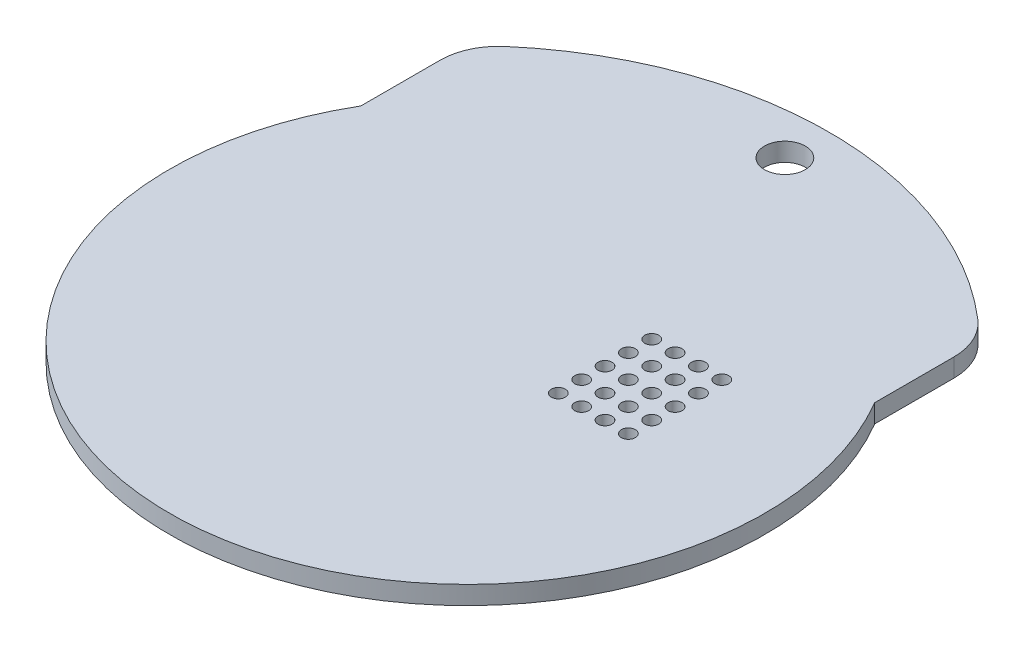
ISO-10303-21;
HEADER;
FILE_DESCRIPTION(('STEP AP214'),'2;1');
FILE_NAME('part.step','',(''),(''),'','','');
FILE_SCHEMA(('AUTOMOTIVE_DESIGN { 1 0 10303 214 1 1 1 1 }'));
ENDSEC;
DATA;
#1=APPLICATION_CONTEXT('core data for automotive mechanical design processes');
#2=APPLICATION_PROTOCOL_DEFINITION('international standard','automotive_design',2000,#1);
#3=PRODUCT_CONTEXT('',#1,'mechanical');
#4=PRODUCT('Part','Part','',(#3));
#5=PRODUCT_RELATED_PRODUCT_CATEGORY('part','',(#4));
#6=PRODUCT_DEFINITION_FORMATION('','',#4);
#7=PRODUCT_DEFINITION_CONTEXT('part definition',#1,'design');
#8=PRODUCT_DEFINITION('design','',#6,#7);
#9=PRODUCT_DEFINITION_SHAPE('','',#8);
#10=(LENGTH_UNIT() NAMED_UNIT(*) SI_UNIT(.MILLI.,.METRE.));
#11=(NAMED_UNIT(*) PLANE_ANGLE_UNIT() SI_UNIT($,.RADIAN.));
#12=(NAMED_UNIT(*) SI_UNIT($,.STERADIAN.) SOLID_ANGLE_UNIT());
#13=UNCERTAINTY_MEASURE_WITH_UNIT(LENGTH_MEASURE(1.E-05),#10,'distance_accuracy_value','');
#14=(GEOMETRIC_REPRESENTATION_CONTEXT(3) GLOBAL_UNCERTAINTY_ASSIGNED_CONTEXT((#13)) GLOBAL_UNIT_ASSIGNED_CONTEXT((#10,
#11,#12)) REPRESENTATION_CONTEXT('',''));
#15=CARTESIAN_POINT('',(0.,0.,0.));
#16=DIRECTION('',(0.,0.,1.));
#17=DIRECTION('',(1.,0.,0.));
#18=AXIS2_PLACEMENT_3D('',#15,#16,#17);
#19=CARTESIAN_POINT('',(0.,2.,0.));
#20=DIRECTION('',(0.,-1.,0.));
#21=DIRECTION('',(0.,0.,-1.));
#22=AXIS2_PLACEMENT_3D('',#19,#20,#21);
#23=CYLINDRICAL_SURFACE('',#22,32.385);
#24=CARTESIAN_POINT('',(0.,0.,0.));
#25=DIRECTION('',(0.,1.,0.));
#26=DIRECTION('',(0.,0.,1.));
#27=AXIS2_PLACEMENT_3D('',#24,#25,#26);
#28=CIRCLE('',#27,32.385);
#29=CARTESIAN_POINT('',(-27.94,0.,-16.3751221369491));
#30=VERTEX_POINT('',#29);
#31=CARTESIAN_POINT('',(27.94,0.,-16.3751221369491));
#32=VERTEX_POINT('',#31);
#33=EDGE_CURVE('E103',#30,#32,#28,.T.);
#34=ORIENTED_EDGE('',*,*,#33,.T.);
#35=DIRECTION('',(0.,-1.,0.));
#36=VECTOR('',#35,1.);
#37=CARTESIAN_POINT('',(27.94,2.,-16.3751221369491));
#38=LINE('',#37,#36);
#39=CARTESIAN_POINT('',(27.94,2.,-16.3751221369491));
#40=VERTEX_POINT('',#39);
#41=EDGE_CURVE('E90',#40,#32,#38,.T.);
#42=ORIENTED_EDGE('',*,*,#41,.F.);
#43=CARTESIAN_POINT('',(0.,2.,0.));
#44=DIRECTION('',(0.,1.,0.));
#45=DIRECTION('',(0.,0.,1.));
#46=AXIS2_PLACEMENT_3D('',#43,#44,#45);
#47=CIRCLE('',#46,32.385);
#48=CARTESIAN_POINT('',(-27.94,2.,-16.3751221369491));
#49=VERTEX_POINT('',#48);
#50=EDGE_CURVE('E94',#49,#40,#47,.T.);
#51=ORIENTED_EDGE('',*,*,#50,.F.);
#52=DIRECTION('',(0.,-1.,0.));
#53=VECTOR('',#52,1.);
#54=CARTESIAN_POINT('',(-27.94,2.,-16.3751221369491));
#55=LINE('',#54,#53);
#56=EDGE_CURVE('E105',#49,#30,#55,.T.);
#57=ORIENTED_EDGE('',*,*,#56,.T.);
#58=EDGE_LOOP('',(#34,#42,#51,#57));
#59=FACE_BOUND('',#58,.T.);
#60=ADVANCED_FACE('F32',(#59),#23,.T.);
#61=CARTESIAN_POINT('',(27.94,2.,-3.4925));
#62=DIRECTION('',(-1.,0.,0.));
#63=DIRECTION('',(0.,0.,1.));
#64=AXIS2_PLACEMENT_3D('',#61,#62,#63);
#65=PLANE('',#64);
#66=DIRECTION('',(0.,0.,-1.));
#67=VECTOR('',#66,1.);
#68=CARTESIAN_POINT('',(27.94,0.,-3.4925));
#69=LINE('',#68,#67);
#70=CARTESIAN_POINT('',(27.94,0.,-24.9838407775906));
#71=VERTEX_POINT('',#70);
#72=EDGE_CURVE('E131',#32,#71,#69,.T.);
#73=ORIENTED_EDGE('',*,*,#72,.T.);
#74=DIRECTION('',(0.,1.,0.));
#75=VECTOR('',#74,1.);
#76=CARTESIAN_POINT('',(27.94,2.,-24.9838407775906));
#77=LINE('',#76,#75);
#78=CARTESIAN_POINT('',(27.94,2.,-24.9838407775906));
#79=VERTEX_POINT('',#78);
#80=EDGE_CURVE('E55',#71,#79,#77,.T.);
#81=ORIENTED_EDGE('',*,*,#80,.T.);
#82=DIRECTION('',(0.,0.,-1.));
#83=VECTOR('',#82,1.);
#84=CARTESIAN_POINT('',(27.94,2.,-3.4925));
#85=LINE('',#84,#83);
#86=EDGE_CURVE('E86',#40,#79,#85,.T.);
#87=ORIENTED_EDGE('',*,*,#86,.F.);
#88=ORIENTED_EDGE('',*,*,#41,.T.);
#89=EDGE_LOOP('',(#73,#81,#87,#88));
#90=FACE_BOUND('',#89,.T.);
#91=ADVANCED_FACE('F88',(#90),#65,.F.);
#92=CARTESIAN_POINT('',(0.,2.,0.));
#93=DIRECTION('',(0.,-1.,0.));
#94=DIRECTION('',(0.,0.,-1.));
#95=AXIS2_PLACEMENT_3D('',#92,#93,#94);
#96=CYLINDRICAL_SURFACE('',#95,39.37);
#97=CARTESIAN_POINT('',(0.,2.,0.));
#98=DIRECTION('',(0.,1.,0.));
#99=DIRECTION('',(0.,0.,1.));
#100=AXIS2_PLACEMENT_3D('',#97,#98,#99);
#101=CIRCLE('',#100,39.37);
#102=CARTESIAN_POINT('',(-25.7419230769231,2.,-29.7884255425119));
#103=VERTEX_POINT('',#102);
#104=CARTESIAN_POINT('',(25.7419230769231,2.,-29.7884255425119));
#105=VERTEX_POINT('',#104);
#106=EDGE_CURVE('E93',#103,#105,#101,.F.);
#107=ORIENTED_EDGE('',*,*,#106,.T.);
#108=DIRECTION('',(0.,-1.,0.));
#109=VECTOR('',#108,1.);
#110=CARTESIAN_POINT('',(25.7419230769231,2.,-29.7884255425119));
#111=LINE('',#110,#109);
#112=CARTESIAN_POINT('',(25.7419230769231,0.,-29.7884255425119));
#113=VERTEX_POINT('',#112);
#114=EDGE_CURVE('E107',#105,#113,#111,.T.);
#115=ORIENTED_EDGE('',*,*,#114,.T.);
#116=CARTESIAN_POINT('',(0.,0.,0.));
#117=DIRECTION('',(0.,1.,0.));
#118=DIRECTION('',(0.,0.,1.));
#119=AXIS2_PLACEMENT_3D('',#116,#117,#118);
#120=CIRCLE('',#119,39.37);
#121=CARTESIAN_POINT('',(-25.7419230769231,0.,-29.7884255425119));
#122=VERTEX_POINT('',#121);
#123=EDGE_CURVE('E132',#122,#113,#120,.F.);
#124=ORIENTED_EDGE('',*,*,#123,.F.);
#125=DIRECTION('',(0.,-1.,0.));
#126=VECTOR('',#125,1.);
#127=CARTESIAN_POINT('',(-25.7419230769231,2.,-29.7884255425119));
#128=LINE('',#127,#126);
#129=EDGE_CURVE('E104',#122,#103,#128,.F.);
#130=ORIENTED_EDGE('',*,*,#129,.T.);
#131=EDGE_LOOP('',(#107,#115,#124,#130));
#132=FACE_BOUND('',#131,.T.);
#133=ADVANCED_FACE('F123',(#132),#96,.T.);
#134=CARTESIAN_POINT('',(-27.94,2.,-3.4925));
#135=DIRECTION('',(-1.,0.,0.));
#136=DIRECTION('',(0.,0.,1.));
#137=AXIS2_PLACEMENT_3D('',#134,#135,#136);
#138=PLANE('',#137);
#139=DIRECTION('',(0.,0.,-1.));
#140=VECTOR('',#139,1.);
#141=CARTESIAN_POINT('',(-27.94,2.,-3.4925));
#142=LINE('',#141,#140);
#143=CARTESIAN_POINT('',(-27.94,2.,-24.9838407775906));
#144=VERTEX_POINT('',#143);
#145=EDGE_CURVE('E98',#49,#144,#142,.T.);
#146=ORIENTED_EDGE('',*,*,#145,.T.);
#147=DIRECTION('',(0.,-1.,0.));
#148=VECTOR('',#147,1.);
#149=CARTESIAN_POINT('',(-27.94,2.,-24.9838407775906));
#150=LINE('',#149,#148);
#151=CARTESIAN_POINT('',(-27.94,0.,-24.9838407775906));
#152=VERTEX_POINT('',#151);
#153=EDGE_CURVE('E11',#144,#152,#150,.T.);
#154=ORIENTED_EDGE('',*,*,#153,.T.);
#155=DIRECTION('',(0.,0.,-1.));
#156=VECTOR('',#155,1.);
#157=CARTESIAN_POINT('',(-27.94,0.,-3.4925));
#158=LINE('',#157,#156);
#159=EDGE_CURVE('E100',#30,#152,#158,.T.);
#160=ORIENTED_EDGE('',*,*,#159,.F.);
#161=ORIENTED_EDGE('',*,*,#56,.F.);
#162=EDGE_LOOP('',(#146,#154,#160,#161));
#163=FACE_BOUND('',#162,.T.);
#164=ADVANCED_FACE('F141',(#163),#138,.T.);
#165=CARTESIAN_POINT('',(-75.3283844524084,2.,-3.4925));
#166=DIRECTION('',(0.,1.,0.));
#167=DIRECTION('',(0.,0.,1.));
#168=AXIS2_PLACEMENT_3D('',#165,#166,#167);
#169=PLANE('',#168);
#170=CARTESIAN_POINT('',(17.4625000000001,2.,-0.0635000000000011));
#171=DIRECTION('',(0.,1.,0.));
#172=DIRECTION('',(0.,0.,1.));
#173=AXIS2_PLACEMENT_3D('',#170,#171,#172);
#174=CIRCLE('',#173,0.761999999999999);
#175=CARTESIAN_POINT('',(17.4625000000001,2.,0.698499999999998));
#176=VERTEX_POINT('',#175);
#177=EDGE_CURVE('E256',#176,#176,#174,.T.);
#178=ORIENTED_EDGE('',*,*,#177,.F.);
#179=EDGE_LOOP('',(#178));
#180=FACE_BOUND('',#179,.T.);
#181=CARTESIAN_POINT('',(14.9225000000001,2.,-0.0635000000000011));
#182=DIRECTION('',(0.,1.,0.));
#183=DIRECTION('',(0.,0.,1.));
#184=AXIS2_PLACEMENT_3D('',#181,#182,#183);
#185=CIRCLE('',#184,0.762000000000003);
#186=CARTESIAN_POINT('',(14.9225000000001,2.,0.698500000000002));
#187=VERTEX_POINT('',#186);
#188=EDGE_CURVE('E260',#187,#187,#185,.T.);
#189=ORIENTED_EDGE('',*,*,#188,.F.);
#190=EDGE_LOOP('',(#189));
#191=FACE_BOUND('',#190,.T.);
#192=CARTESIAN_POINT('',(12.3825000000001,2.,-0.0635000000000011));
#193=DIRECTION('',(0.,1.,0.));
#194=DIRECTION('',(0.,0.,1.));
#195=AXIS2_PLACEMENT_3D('',#192,#193,#194);
#196=CIRCLE('',#195,0.762000000000001);
#197=CARTESIAN_POINT('',(12.3825000000001,2.,0.6985));
#198=VERTEX_POINT('',#197);
#199=EDGE_CURVE('E267',#198,#198,#196,.T.);
#200=ORIENTED_EDGE('',*,*,#199,.F.);
#201=EDGE_LOOP('',(#200));
#202=FACE_BOUND('',#201,.T.);
#203=CARTESIAN_POINT('',(9.8425000000001,2.,-0.0635000000000011));
#204=DIRECTION('',(0.,1.,0.));
#205=DIRECTION('',(0.,0.,1.));
#206=AXIS2_PLACEMENT_3D('',#203,#204,#205);
#207=CIRCLE('',#206,0.762000000000001);
#208=CARTESIAN_POINT('',(9.8425000000001,2.,0.6985));
#209=VERTEX_POINT('',#208);
#210=EDGE_CURVE('E273',#209,#209,#207,.T.);
#211=ORIENTED_EDGE('',*,*,#210,.F.);
#212=EDGE_LOOP('',(#211));
#213=FACE_BOUND('',#212,.T.);
#214=CARTESIAN_POINT('',(9.84250000000008,2.,-2.6035));
#215=DIRECTION('',(0.,1.,0.));
#216=DIRECTION('',(0.,0.,1.));
#217=AXIS2_PLACEMENT_3D('',#214,#215,#216);
#218=CIRCLE('',#217,0.762000000000001);
#219=CARTESIAN_POINT('',(9.84250000000008,2.,-1.8415));
#220=VERTEX_POINT('',#219);
#221=EDGE_CURVE('E279',#220,#220,#218,.T.);
#222=ORIENTED_EDGE('',*,*,#221,.F.);
#223=EDGE_LOOP('',(#222));
#224=FACE_BOUND('',#223,.T.);
#225=CARTESIAN_POINT('',(12.3825000000001,2.,-2.6035));
#226=DIRECTION('',(0.,1.,0.));
#227=DIRECTION('',(0.,0.,1.));
#228=AXIS2_PLACEMENT_3D('',#225,#226,#227);
#229=CIRCLE('',#228,0.762000000000001);
#230=CARTESIAN_POINT('',(12.3825000000001,2.,-1.8415));
#231=VERTEX_POINT('',#230);
#232=EDGE_CURVE('E285',#231,#231,#229,.T.);
#233=ORIENTED_EDGE('',*,*,#232,.F.);
#234=EDGE_LOOP('',(#233));
#235=FACE_BOUND('',#234,.T.);
#236=CARTESIAN_POINT('',(14.9225000000001,2.,-2.6035));
#237=DIRECTION('',(0.,1.,0.));
#238=DIRECTION('',(0.,0.,1.));
#239=AXIS2_PLACEMENT_3D('',#236,#237,#238);
#240=CIRCLE('',#239,0.762000000000001);
#241=CARTESIAN_POINT('',(14.9225000000001,2.,-1.8415));
#242=VERTEX_POINT('',#241);
#243=EDGE_CURVE('E291',#242,#242,#240,.T.);
#244=ORIENTED_EDGE('',*,*,#243,.F.);
#245=EDGE_LOOP('',(#244));
#246=FACE_BOUND('',#245,.T.);
#247=CARTESIAN_POINT('',(17.4625000000001,2.,-2.6035));
#248=DIRECTION('',(0.,1.,0.));
#249=DIRECTION('',(0.,0.,1.));
#250=AXIS2_PLACEMENT_3D('',#247,#248,#249);
#251=CIRCLE('',#250,0.761999999999999);
#252=CARTESIAN_POINT('',(17.4625000000001,2.,-1.8415));
#253=VERTEX_POINT('',#252);
#254=EDGE_CURVE('E297',#253,#253,#251,.T.);
#255=ORIENTED_EDGE('',*,*,#254,.F.);
#256=EDGE_LOOP('',(#255));
#257=FACE_BOUND('',#256,.T.);
#258=CARTESIAN_POINT('',(17.4625,2.,-5.1435));
#259=DIRECTION('',(0.,1.,0.));
#260=DIRECTION('',(0.,0.,1.));
#261=AXIS2_PLACEMENT_3D('',#258,#259,#260);
#262=CIRCLE('',#261,0.761999999999999);
#263=CARTESIAN_POINT('',(17.4625,2.,-4.3815));
#264=VERTEX_POINT('',#263);
#265=EDGE_CURVE('E303',#264,#264,#262,.T.);
#266=ORIENTED_EDGE('',*,*,#265,.F.);
#267=EDGE_LOOP('',(#266));
#268=FACE_BOUND('',#267,.T.);
#269=CARTESIAN_POINT('',(14.9225,2.,-5.1435));
#270=DIRECTION('',(0.,1.,0.));
#271=DIRECTION('',(0.,0.,1.));
#272=AXIS2_PLACEMENT_3D('',#269,#270,#271);
#273=CIRCLE('',#272,0.761999999999999);
#274=CARTESIAN_POINT('',(14.9225,2.,-4.3815));
#275=VERTEX_POINT('',#274);
#276=EDGE_CURVE('E309',#275,#275,#273,.T.);
#277=ORIENTED_EDGE('',*,*,#276,.F.);
#278=EDGE_LOOP('',(#277));
#279=FACE_BOUND('',#278,.T.);
#280=CARTESIAN_POINT('',(12.3825,2.,-5.1435));
#281=DIRECTION('',(0.,1.,0.));
#282=DIRECTION('',(0.,0.,1.));
#283=AXIS2_PLACEMENT_3D('',#280,#281,#282);
#284=CIRCLE('',#283,0.762000000000001);
#285=CARTESIAN_POINT('',(12.3825,2.,-4.3815));
#286=VERTEX_POINT('',#285);
#287=EDGE_CURVE('E315',#286,#286,#284,.T.);
#288=ORIENTED_EDGE('',*,*,#287,.F.);
#289=EDGE_LOOP('',(#288));
#290=FACE_BOUND('',#289,.T.);
#291=CARTESIAN_POINT('',(9.84250000000005,2.,-5.1435));
#292=DIRECTION('',(0.,1.,0.));
#293=DIRECTION('',(0.,0.,1.));
#294=AXIS2_PLACEMENT_3D('',#291,#292,#293);
#295=CIRCLE('',#294,0.762000000000001);
#296=CARTESIAN_POINT('',(9.84250000000005,2.,-4.3815));
#297=VERTEX_POINT('',#296);
#298=EDGE_CURVE('E321',#297,#297,#295,.T.);
#299=ORIENTED_EDGE('',*,*,#298,.F.);
#300=EDGE_LOOP('',(#299));
#301=FACE_BOUND('',#300,.T.);
#302=CARTESIAN_POINT('',(17.4625,2.,-7.6835));
#303=DIRECTION('',(0.,1.,0.));
#304=DIRECTION('',(0.,0.,1.));
#305=AXIS2_PLACEMENT_3D('',#302,#303,#304);
#306=CIRCLE('',#305,0.761999999999999);
#307=CARTESIAN_POINT('',(17.4625,2.,-6.9215));
#308=VERTEX_POINT('',#307);
#309=EDGE_CURVE('E327',#308,#308,#306,.T.);
#310=ORIENTED_EDGE('',*,*,#309,.F.);
#311=EDGE_LOOP('',(#310));
#312=FACE_BOUND('',#311,.T.);
#313=CARTESIAN_POINT('',(14.9225,2.,-7.6835));
#314=DIRECTION('',(0.,1.,0.));
#315=DIRECTION('',(0.,0.,1.));
#316=AXIS2_PLACEMENT_3D('',#313,#314,#315);
#317=CIRCLE('',#316,0.762000000000003);
#318=CARTESIAN_POINT('',(14.9225,2.,-6.9215));
#319=VERTEX_POINT('',#318);
#320=EDGE_CURVE('E333',#319,#319,#317,.T.);
#321=ORIENTED_EDGE('',*,*,#320,.F.);
#322=EDGE_LOOP('',(#321));
#323=FACE_BOUND('',#322,.T.);
#324=CARTESIAN_POINT('',(12.3825,2.,-7.6835));
#325=DIRECTION('',(0.,1.,0.));
#326=DIRECTION('',(0.,0.,1.));
#327=AXIS2_PLACEMENT_3D('',#324,#325,#326);
#328=CIRCLE('',#327,0.762000000000001);
#329=CARTESIAN_POINT('',(12.3825,2.,-6.9215));
#330=VERTEX_POINT('',#329);
#331=EDGE_CURVE('E339',#330,#330,#328,.T.);
#332=ORIENTED_EDGE('',*,*,#331,.F.);
#333=EDGE_LOOP('',(#332));
#334=FACE_BOUND('',#333,.T.);
#335=CARTESIAN_POINT('',(9.84250000000002,2.,-7.6835));
#336=DIRECTION('',(0.,1.,0.));
#337=DIRECTION('',(0.,0.,1.));
#338=AXIS2_PLACEMENT_3D('',#335,#336,#337);
#339=CIRCLE('',#338,0.762000000000001);
#340=CARTESIAN_POINT('',(9.84250000000002,2.,-6.9215));
#341=VERTEX_POINT('',#340);
#342=EDGE_CURVE('E345',#341,#341,#339,.T.);
#343=ORIENTED_EDGE('',*,*,#342,.F.);
#344=EDGE_LOOP('',(#343));
#345=FACE_BOUND('',#344,.T.);
#346=CARTESIAN_POINT('',(17.4625,2.,-10.2235));
#347=DIRECTION('',(0.,1.,0.));
#348=DIRECTION('',(0.,0.,1.));
#349=AXIS2_PLACEMENT_3D('',#346,#347,#348);
#350=CIRCLE('',#349,0.761999999999999);
#351=CARTESIAN_POINT('',(17.4625,2.,-9.4615));
#352=VERTEX_POINT('',#351);
#353=EDGE_CURVE('E351',#352,#352,#350,.T.);
#354=ORIENTED_EDGE('',*,*,#353,.F.);
#355=EDGE_LOOP('',(#354));
#356=FACE_BOUND('',#355,.T.);
#357=CARTESIAN_POINT('',(14.9225,2.,-10.2235));
#358=DIRECTION('',(0.,1.,0.));
#359=DIRECTION('',(0.,0.,1.));
#360=AXIS2_PLACEMENT_3D('',#357,#358,#359);
#361=CIRCLE('',#360,0.762000000000001);
#362=CARTESIAN_POINT('',(14.9225,2.,-9.4615));
#363=VERTEX_POINT('',#362);
#364=EDGE_CURVE('E357',#363,#363,#361,.T.);
#365=ORIENTED_EDGE('',*,*,#364,.F.);
#366=EDGE_LOOP('',(#365));
#367=FACE_BOUND('',#366,.T.);
#368=CARTESIAN_POINT('',(12.3825,2.,-10.2235));
#369=DIRECTION('',(0.,1.,0.));
#370=DIRECTION('',(0.,0.,1.));
#371=AXIS2_PLACEMENT_3D('',#368,#369,#370);
#372=CIRCLE('',#371,0.762000000000001);
#373=CARTESIAN_POINT('',(12.3825,2.,-9.4615));
#374=VERTEX_POINT('',#373);
#375=EDGE_CURVE('E363',#374,#374,#372,.T.);
#376=ORIENTED_EDGE('',*,*,#375,.F.);
#377=EDGE_LOOP('',(#376));
#378=FACE_BOUND('',#377,.T.);
#379=CARTESIAN_POINT('',(9.8425,2.,-10.2235));
#380=DIRECTION('',(0.,1.,0.));
#381=DIRECTION('',(0.,0.,1.));
#382=AXIS2_PLACEMENT_3D('',#379,#380,#381);
#383=CIRCLE('',#382,0.762000000000001);
#384=CARTESIAN_POINT('',(9.8425,2.,-9.4615));
#385=VERTEX_POINT('',#384);
#386=EDGE_CURVE('E366',#385,#385,#383,.T.);
#387=ORIENTED_EDGE('',*,*,#386,.F.);
#388=EDGE_LOOP('',(#387));
#389=FACE_BOUND('',#388,.T.);
#390=CARTESIAN_POINT('',(0.,2.,-34.544));
#391=DIRECTION('',(0.,1.,0.));
#392=DIRECTION('',(0.,0.,1.));
#393=AXIS2_PLACEMENT_3D('',#390,#391,#392);
#394=CIRCLE('',#393,2.2225);
#395=CARTESIAN_POINT('',(0.,2.,-32.3215));
#396=VERTEX_POINT('',#395);
#397=EDGE_CURVE('E372',#396,#396,#394,.T.);
#398=ORIENTED_EDGE('',*,*,#397,.F.);
#399=EDGE_LOOP('',(#398));
#400=FACE_BOUND('',#399,.T.);
#401=ORIENTED_EDGE('',*,*,#86,.T.);
#402=CARTESIAN_POINT('',(21.59,2.,-24.9838407775906));
#403=DIRECTION('',(0.,1.,0.));
#404=DIRECTION('',(0.,0.,1.));
#405=AXIS2_PLACEMENT_3D('',#402,#403,#404);
#406=CIRCLE('',#405,6.35);
#407=EDGE_CURVE('E40',#79,#105,#406,.T.);
#408=ORIENTED_EDGE('',*,*,#407,.T.);
#409=ORIENTED_EDGE('',*,*,#106,.F.);
#410=CARTESIAN_POINT('',(-21.59,2.,-24.9838407775906));
#411=DIRECTION('',(0.,1.,0.));
#412=DIRECTION('',(0.,0.,1.));
#413=AXIS2_PLACEMENT_3D('',#410,#411,#412);
#414=CIRCLE('',#413,6.35);
#415=EDGE_CURVE('E47',#103,#144,#414,.T.);
#416=ORIENTED_EDGE('',*,*,#415,.T.);
#417=ORIENTED_EDGE('',*,*,#145,.F.);
#418=ORIENTED_EDGE('',*,*,#50,.T.);
#419=EDGE_LOOP('',(#401,#408,#409,#416,#417,#418));
#420=FACE_BOUND('',#419,.T.);
#421=ADVANCED_FACE('F97',(#180,#191,#202,#213,#224,#235,#246,#257,#268,#279,#290,#301,#312,#323,
#334,#345,#356,#367,#378,#389,#400,#420),#169,.T.);
#422=CARTESIAN_POINT('',(-75.3283844524084,0.,-3.4925));
#423=DIRECTION('',(0.,1.,0.));
#424=DIRECTION('',(0.,0.,1.));
#425=AXIS2_PLACEMENT_3D('',#422,#423,#424);
#426=PLANE('',#425);
#427=CARTESIAN_POINT('',(17.4625000000001,0.,-0.0635000000000011));
#428=DIRECTION('',(0.,1.,0.));
#429=DIRECTION('',(0.,0.,1.));
#430=AXIS2_PLACEMENT_3D('',#427,#428,#429);
#431=CIRCLE('',#430,0.761999999999999);
#432=CARTESIAN_POINT('',(17.4625000000001,0.,0.698499999999998));
#433=VERTEX_POINT('',#432);
#434=EDGE_CURVE('E253',#433,#433,#431,.T.);
#435=ORIENTED_EDGE('',*,*,#434,.T.);
#436=EDGE_LOOP('',(#435));
#437=FACE_BOUND('',#436,.T.);
#438=CARTESIAN_POINT('',(14.9225000000001,0.,-0.0635000000000011));
#439=DIRECTION('',(0.,1.,0.));
#440=DIRECTION('',(0.,0.,1.));
#441=AXIS2_PLACEMENT_3D('',#438,#439,#440);
#442=CIRCLE('',#441,0.762000000000003);
#443=CARTESIAN_POINT('',(14.9225000000001,0.,0.698500000000002));
#444=VERTEX_POINT('',#443);
#445=EDGE_CURVE('E257',#444,#444,#442,.T.);
#446=ORIENTED_EDGE('',*,*,#445,.T.);
#447=EDGE_LOOP('',(#446));
#448=FACE_BOUND('',#447,.T.);
#449=CARTESIAN_POINT('',(12.3825000000001,0.,-0.0635000000000011));
#450=DIRECTION('',(0.,1.,0.));
#451=DIRECTION('',(0.,0.,1.));
#452=AXIS2_PLACEMENT_3D('',#449,#450,#451);
#453=CIRCLE('',#452,0.762000000000001);
#454=CARTESIAN_POINT('',(12.3825000000001,0.,0.6985));
#455=VERTEX_POINT('',#454);
#456=EDGE_CURVE('E265',#455,#455,#453,.T.);
#457=ORIENTED_EDGE('',*,*,#456,.T.);
#458=EDGE_LOOP('',(#457));
#459=FACE_BOUND('',#458,.T.);
#460=CARTESIAN_POINT('',(9.8425000000001,0.,-0.0635000000000011));
#461=DIRECTION('',(0.,1.,0.));
#462=DIRECTION('',(0.,0.,1.));
#463=AXIS2_PLACEMENT_3D('',#460,#461,#462);
#464=CIRCLE('',#463,0.762000000000001);
#465=CARTESIAN_POINT('',(9.8425000000001,0.,0.6985));
#466=VERTEX_POINT('',#465);
#467=EDGE_CURVE('E270',#466,#466,#464,.T.);
#468=ORIENTED_EDGE('',*,*,#467,.T.);
#469=EDGE_LOOP('',(#468));
#470=FACE_BOUND('',#469,.T.);
#471=CARTESIAN_POINT('',(9.84250000000008,0.,-2.6035));
#472=DIRECTION('',(0.,1.,0.));
#473=DIRECTION('',(0.,0.,1.));
#474=AXIS2_PLACEMENT_3D('',#471,#472,#473);
#475=CIRCLE('',#474,0.762000000000001);
#476=CARTESIAN_POINT('',(9.84250000000008,0.,-1.8415));
#477=VERTEX_POINT('',#476);
#478=EDGE_CURVE('E276',#477,#477,#475,.T.);
#479=ORIENTED_EDGE('',*,*,#478,.T.);
#480=EDGE_LOOP('',(#479));
#481=FACE_BOUND('',#480,.T.);
#482=CARTESIAN_POINT('',(12.3825000000001,0.,-2.6035));
#483=DIRECTION('',(0.,1.,0.));
#484=DIRECTION('',(0.,0.,1.));
#485=AXIS2_PLACEMENT_3D('',#482,#483,#484);
#486=CIRCLE('',#485,0.762000000000001);
#487=CARTESIAN_POINT('',(12.3825000000001,0.,-1.8415));
#488=VERTEX_POINT('',#487);
#489=EDGE_CURVE('E282',#488,#488,#486,.T.);
#490=ORIENTED_EDGE('',*,*,#489,.T.);
#491=EDGE_LOOP('',(#490));
#492=FACE_BOUND('',#491,.T.);
#493=CARTESIAN_POINT('',(14.9225000000001,0.,-2.6035));
#494=DIRECTION('',(0.,1.,0.));
#495=DIRECTION('',(0.,0.,1.));
#496=AXIS2_PLACEMENT_3D('',#493,#494,#495);
#497=CIRCLE('',#496,0.762000000000001);
#498=CARTESIAN_POINT('',(14.9225000000001,0.,-1.8415));
#499=VERTEX_POINT('',#498);
#500=EDGE_CURVE('E288',#499,#499,#497,.T.);
#501=ORIENTED_EDGE('',*,*,#500,.T.);
#502=EDGE_LOOP('',(#501));
#503=FACE_BOUND('',#502,.T.);
#504=CARTESIAN_POINT('',(17.4625000000001,0.,-2.6035));
#505=DIRECTION('',(0.,1.,0.));
#506=DIRECTION('',(0.,0.,1.));
#507=AXIS2_PLACEMENT_3D('',#504,#505,#506);
#508=CIRCLE('',#507,0.761999999999999);
#509=CARTESIAN_POINT('',(17.4625000000001,0.,-1.8415));
#510=VERTEX_POINT('',#509);
#511=EDGE_CURVE('E294',#510,#510,#508,.T.);
#512=ORIENTED_EDGE('',*,*,#511,.T.);
#513=EDGE_LOOP('',(#512));
#514=FACE_BOUND('',#513,.T.);
#515=CARTESIAN_POINT('',(17.4625,0.,-5.1435));
#516=DIRECTION('',(0.,1.,0.));
#517=DIRECTION('',(0.,0.,1.));
#518=AXIS2_PLACEMENT_3D('',#515,#516,#517);
#519=CIRCLE('',#518,0.761999999999999);
#520=CARTESIAN_POINT('',(17.4625,0.,-4.3815));
#521=VERTEX_POINT('',#520);
#522=EDGE_CURVE('E300',#521,#521,#519,.T.);
#523=ORIENTED_EDGE('',*,*,#522,.T.);
#524=EDGE_LOOP('',(#523));
#525=FACE_BOUND('',#524,.T.);
#526=CARTESIAN_POINT('',(14.9225,0.,-5.1435));
#527=DIRECTION('',(0.,1.,0.));
#528=DIRECTION('',(0.,0.,1.));
#529=AXIS2_PLACEMENT_3D('',#526,#527,#528);
#530=CIRCLE('',#529,0.761999999999999);
#531=CARTESIAN_POINT('',(14.9225,0.,-4.3815));
#532=VERTEX_POINT('',#531);
#533=EDGE_CURVE('E306',#532,#532,#530,.T.);
#534=ORIENTED_EDGE('',*,*,#533,.T.);
#535=EDGE_LOOP('',(#534));
#536=FACE_BOUND('',#535,.T.);
#537=CARTESIAN_POINT('',(12.3825,0.,-5.1435));
#538=DIRECTION('',(0.,1.,0.));
#539=DIRECTION('',(0.,0.,1.));
#540=AXIS2_PLACEMENT_3D('',#537,#538,#539);
#541=CIRCLE('',#540,0.762000000000001);
#542=CARTESIAN_POINT('',(12.3825,0.,-4.3815));
#543=VERTEX_POINT('',#542);
#544=EDGE_CURVE('E312',#543,#543,#541,.T.);
#545=ORIENTED_EDGE('',*,*,#544,.T.);
#546=EDGE_LOOP('',(#545));
#547=FACE_BOUND('',#546,.T.);
#548=CARTESIAN_POINT('',(9.84250000000005,0.,-5.1435));
#549=DIRECTION('',(0.,1.,0.));
#550=DIRECTION('',(0.,0.,1.));
#551=AXIS2_PLACEMENT_3D('',#548,#549,#550);
#552=CIRCLE('',#551,0.762000000000001);
#553=CARTESIAN_POINT('',(9.84250000000005,0.,-4.3815));
#554=VERTEX_POINT('',#553);
#555=EDGE_CURVE('E318',#554,#554,#552,.T.);
#556=ORIENTED_EDGE('',*,*,#555,.T.);
#557=EDGE_LOOP('',(#556));
#558=FACE_BOUND('',#557,.T.);
#559=CARTESIAN_POINT('',(17.4625,0.,-7.6835));
#560=DIRECTION('',(0.,1.,0.));
#561=DIRECTION('',(0.,0.,1.));
#562=AXIS2_PLACEMENT_3D('',#559,#560,#561);
#563=CIRCLE('',#562,0.761999999999999);
#564=CARTESIAN_POINT('',(17.4625,0.,-6.9215));
#565=VERTEX_POINT('',#564);
#566=EDGE_CURVE('E324',#565,#565,#563,.T.);
#567=ORIENTED_EDGE('',*,*,#566,.T.);
#568=EDGE_LOOP('',(#567));
#569=FACE_BOUND('',#568,.T.);
#570=CARTESIAN_POINT('',(14.9225,0.,-7.6835));
#571=DIRECTION('',(0.,1.,0.));
#572=DIRECTION('',(0.,0.,1.));
#573=AXIS2_PLACEMENT_3D('',#570,#571,#572);
#574=CIRCLE('',#573,0.762000000000003);
#575=CARTESIAN_POINT('',(14.9225,0.,-6.9215));
#576=VERTEX_POINT('',#575);
#577=EDGE_CURVE('E330',#576,#576,#574,.T.);
#578=ORIENTED_EDGE('',*,*,#577,.T.);
#579=EDGE_LOOP('',(#578));
#580=FACE_BOUND('',#579,.T.);
#581=CARTESIAN_POINT('',(12.3825,0.,-7.6835));
#582=DIRECTION('',(0.,1.,0.));
#583=DIRECTION('',(0.,0.,1.));
#584=AXIS2_PLACEMENT_3D('',#581,#582,#583);
#585=CIRCLE('',#584,0.762000000000001);
#586=CARTESIAN_POINT('',(12.3825,0.,-6.9215));
#587=VERTEX_POINT('',#586);
#588=EDGE_CURVE('E336',#587,#587,#585,.T.);
#589=ORIENTED_EDGE('',*,*,#588,.T.);
#590=EDGE_LOOP('',(#589));
#591=FACE_BOUND('',#590,.T.);
#592=CARTESIAN_POINT('',(9.84250000000002,0.,-7.6835));
#593=DIRECTION('',(0.,1.,0.));
#594=DIRECTION('',(0.,0.,1.));
#595=AXIS2_PLACEMENT_3D('',#592,#593,#594);
#596=CIRCLE('',#595,0.762000000000001);
#597=CARTESIAN_POINT('',(9.84250000000002,0.,-6.9215));
#598=VERTEX_POINT('',#597);
#599=EDGE_CURVE('E342',#598,#598,#596,.T.);
#600=ORIENTED_EDGE('',*,*,#599,.T.);
#601=EDGE_LOOP('',(#600));
#602=FACE_BOUND('',#601,.T.);
#603=CARTESIAN_POINT('',(17.4625,0.,-10.2235));
#604=DIRECTION('',(0.,1.,0.));
#605=DIRECTION('',(0.,0.,1.));
#606=AXIS2_PLACEMENT_3D('',#603,#604,#605);
#607=CIRCLE('',#606,0.761999999999999);
#608=CARTESIAN_POINT('',(17.4625,0.,-9.4615));
#609=VERTEX_POINT('',#608);
#610=EDGE_CURVE('E348',#609,#609,#607,.T.);
#611=ORIENTED_EDGE('',*,*,#610,.T.);
#612=EDGE_LOOP('',(#611));
#613=FACE_BOUND('',#612,.T.);
#614=CARTESIAN_POINT('',(14.9225,0.,-10.2235));
#615=DIRECTION('',(0.,1.,0.));
#616=DIRECTION('',(0.,0.,1.));
#617=AXIS2_PLACEMENT_3D('',#614,#615,#616);
#618=CIRCLE('',#617,0.762000000000001);
#619=CARTESIAN_POINT('',(14.9225,0.,-9.4615));
#620=VERTEX_POINT('',#619);
#621=EDGE_CURVE('E354',#620,#620,#618,.T.);
#622=ORIENTED_EDGE('',*,*,#621,.T.);
#623=EDGE_LOOP('',(#622));
#624=FACE_BOUND('',#623,.T.);
#625=CARTESIAN_POINT('',(12.3825,0.,-10.2235));
#626=DIRECTION('',(0.,1.,0.));
#627=DIRECTION('',(0.,0.,1.));
#628=AXIS2_PLACEMENT_3D('',#625,#626,#627);
#629=CIRCLE('',#628,0.762000000000001);
#630=CARTESIAN_POINT('',(12.3825,0.,-9.4615));
#631=VERTEX_POINT('',#630);
#632=EDGE_CURVE('E360',#631,#631,#629,.T.);
#633=ORIENTED_EDGE('',*,*,#632,.T.);
#634=EDGE_LOOP('',(#633));
#635=FACE_BOUND('',#634,.T.);
#636=CARTESIAN_POINT('',(9.8425,0.,-10.2235));
#637=DIRECTION('',(0.,1.,0.));
#638=DIRECTION('',(0.,0.,1.));
#639=AXIS2_PLACEMENT_3D('',#636,#637,#638);
#640=CIRCLE('',#639,0.762000000000001);
#641=CARTESIAN_POINT('',(9.8425,0.,-9.4615));
#642=VERTEX_POINT('',#641);
#643=EDGE_CURVE('E369',#642,#642,#640,.T.);
#644=ORIENTED_EDGE('',*,*,#643,.T.);
#645=EDGE_LOOP('',(#644));
#646=FACE_BOUND('',#645,.T.);
#647=CARTESIAN_POINT('',(0.,0.,-34.544));
#648=DIRECTION('',(0.,1.,0.));
#649=DIRECTION('',(0.,0.,1.));
#650=AXIS2_PLACEMENT_3D('',#647,#648,#649);
#651=CIRCLE('',#650,2.2225);
#652=CARTESIAN_POINT('',(0.,0.,-32.3215));
#653=VERTEX_POINT('',#652);
#654=EDGE_CURVE('E135',#653,#653,#651,.T.);
#655=ORIENTED_EDGE('',*,*,#654,.T.);
#656=EDGE_LOOP('',(#655));
#657=FACE_BOUND('',#656,.T.);
#658=ORIENTED_EDGE('',*,*,#123,.T.);
#659=CARTESIAN_POINT('',(21.59,0.,-24.9838407775906));
#660=DIRECTION('',(0.,1.,0.));
#661=DIRECTION('',(0.,0.,1.));
#662=AXIS2_PLACEMENT_3D('',#659,#660,#661);
#663=CIRCLE('',#662,6.35);
#664=EDGE_CURVE('E116',#113,#71,#663,.F.);
#665=ORIENTED_EDGE('',*,*,#664,.T.);
#666=ORIENTED_EDGE('',*,*,#72,.F.);
#667=ORIENTED_EDGE('',*,*,#33,.F.);
#668=ORIENTED_EDGE('',*,*,#159,.T.);
#669=CARTESIAN_POINT('',(-21.59,0.,-24.9838407775906));
#670=DIRECTION('',(0.,1.,0.));
#671=DIRECTION('',(0.,0.,1.));
#672=AXIS2_PLACEMENT_3D('',#669,#670,#671);
#673=CIRCLE('',#672,6.35);
#674=EDGE_CURVE('E114',#152,#122,#673,.F.);
#675=ORIENTED_EDGE('',*,*,#674,.T.);
#676=EDGE_LOOP('',(#658,#665,#666,#667,#668,#675));
#677=FACE_BOUND('',#676,.T.);
#678=ADVANCED_FACE('F130',(#437,#448,#459,#470,#481,#492,#503,#514,#525,#536,#547,#558,#569,
#580,#591,#602,#613,#624,#635,#646,#657,#677),#426,.F.);
#679=CARTESIAN_POINT('',(21.59,2.,-24.9838407775906));
#680=DIRECTION('',(0.,-1.,0.));
#681=DIRECTION('',(0.,0.,-1.));
#682=AXIS2_PLACEMENT_3D('',#679,#680,#681);
#683=CYLINDRICAL_SURFACE('',#682,6.35);
#684=ORIENTED_EDGE('',*,*,#407,.F.);
#685=ORIENTED_EDGE('',*,*,#80,.F.);
#686=ORIENTED_EDGE('',*,*,#664,.F.);
#687=ORIENTED_EDGE('',*,*,#114,.F.);
#688=EDGE_LOOP('',(#684,#685,#686,#687));
#689=FACE_BOUND('',#688,.T.);
#690=ADVANCED_FACE('F128',(#689),#683,.T.);
#691=CARTESIAN_POINT('',(-21.59,2.,-24.9838407775906));
#692=DIRECTION('',(0.,-1.,0.));
#693=DIRECTION('',(0.,0.,-1.));
#694=AXIS2_PLACEMENT_3D('',#691,#692,#693);
#695=CYLINDRICAL_SURFACE('',#694,6.35);
#696=ORIENTED_EDGE('',*,*,#415,.F.);
#697=ORIENTED_EDGE('',*,*,#129,.F.);
#698=ORIENTED_EDGE('',*,*,#674,.F.);
#699=ORIENTED_EDGE('',*,*,#153,.F.);
#700=EDGE_LOOP('',(#696,#697,#698,#699));
#701=FACE_BOUND('',#700,.T.);
#702=ADVANCED_FACE('F34',(#701),#695,.T.);
#703=CARTESIAN_POINT('',(0.,0.,-34.544));
#704=DIRECTION('',(0.,1.,0.));
#705=DIRECTION('',(0.,0.,1.));
#706=AXIS2_PLACEMENT_3D('',#703,#704,#705);
#707=CYLINDRICAL_SURFACE('',#706,2.2225);
#708=ORIENTED_EDGE('',*,*,#654,.F.);
#709=EDGE_LOOP('',(#708));
#710=FACE_BOUND('',#709,.T.);
#711=ORIENTED_EDGE('',*,*,#397,.T.);
#712=EDGE_LOOP('',(#711));
#713=FACE_BOUND('',#712,.T.);
#714=ADVANCED_FACE('F145',(#710,#713),#707,.F.);
#715=CARTESIAN_POINT('',(9.8425,0.,-10.2235));
#716=DIRECTION('',(0.,1.,0.));
#717=DIRECTION('',(0.,0.,1.));
#718=AXIS2_PLACEMENT_3D('',#715,#716,#717);
#719=CYLINDRICAL_SURFACE('',#718,0.762000000000001);
#720=ORIENTED_EDGE('',*,*,#643,.F.);
#721=EDGE_LOOP('',(#720));
#722=FACE_BOUND('',#721,.T.);
#723=ORIENTED_EDGE('',*,*,#386,.T.);
#724=EDGE_LOOP('',(#723));
#725=FACE_BOUND('',#724,.T.);
#726=ADVANCED_FACE('F150',(#722,#725),#719,.F.);
#727=CARTESIAN_POINT('',(12.3825,0.,-10.2235));
#728=DIRECTION('',(0.,1.,0.));
#729=DIRECTION('',(0.,0.,1.));
#730=AXIS2_PLACEMENT_3D('',#727,#728,#729);
#731=CYLINDRICAL_SURFACE('',#730,0.762000000000001);
#732=ORIENTED_EDGE('',*,*,#632,.F.);
#733=EDGE_LOOP('',(#732));
#734=FACE_BOUND('',#733,.T.);
#735=ORIENTED_EDGE('',*,*,#375,.T.);
#736=EDGE_LOOP('',(#735));
#737=FACE_BOUND('',#736,.T.);
#738=ADVANCED_FACE('F172',(#734,#737),#731,.F.);
#739=CARTESIAN_POINT('',(14.9225,0.,-10.2235));
#740=DIRECTION('',(0.,1.,0.));
#741=DIRECTION('',(0.,0.,1.));
#742=AXIS2_PLACEMENT_3D('',#739,#740,#741);
#743=CYLINDRICAL_SURFACE('',#742,0.762000000000001);
#744=ORIENTED_EDGE('',*,*,#621,.F.);
#745=EDGE_LOOP('',(#744));
#746=FACE_BOUND('',#745,.T.);
#747=ORIENTED_EDGE('',*,*,#364,.T.);
#748=EDGE_LOOP('',(#747));
#749=FACE_BOUND('',#748,.T.);
#750=ADVANCED_FACE('F176',(#746,#749),#743,.F.);
#751=CARTESIAN_POINT('',(17.4625,0.,-10.2235));
#752=DIRECTION('',(0.,1.,0.));
#753=DIRECTION('',(0.,0.,1.));
#754=AXIS2_PLACEMENT_3D('',#751,#752,#753);
#755=CYLINDRICAL_SURFACE('',#754,0.761999999999999);
#756=ORIENTED_EDGE('',*,*,#610,.F.);
#757=EDGE_LOOP('',(#756));
#758=FACE_BOUND('',#757,.T.);
#759=ORIENTED_EDGE('',*,*,#353,.T.);
#760=EDGE_LOOP('',(#759));
#761=FACE_BOUND('',#760,.T.);
#762=ADVANCED_FACE('F180',(#758,#761),#755,.F.);
#763=CARTESIAN_POINT('',(9.84250000000002,0.,-7.6835));
#764=DIRECTION('',(0.,1.,0.));
#765=DIRECTION('',(0.,0.,1.));
#766=AXIS2_PLACEMENT_3D('',#763,#764,#765);
#767=CYLINDRICAL_SURFACE('',#766,0.762000000000001);
#768=ORIENTED_EDGE('',*,*,#599,.F.);
#769=EDGE_LOOP('',(#768));
#770=FACE_BOUND('',#769,.T.);
#771=ORIENTED_EDGE('',*,*,#342,.T.);
#772=EDGE_LOOP('',(#771));
#773=FACE_BOUND('',#772,.T.);
#774=ADVANCED_FACE('F184',(#770,#773),#767,.F.);
#775=CARTESIAN_POINT('',(12.3825,0.,-7.6835));
#776=DIRECTION('',(0.,1.,0.));
#777=DIRECTION('',(0.,0.,1.));
#778=AXIS2_PLACEMENT_3D('',#775,#776,#777);
#779=CYLINDRICAL_SURFACE('',#778,0.762000000000001);
#780=ORIENTED_EDGE('',*,*,#588,.F.);
#781=EDGE_LOOP('',(#780));
#782=FACE_BOUND('',#781,.T.);
#783=ORIENTED_EDGE('',*,*,#331,.T.);
#784=EDGE_LOOP('',(#783));
#785=FACE_BOUND('',#784,.T.);
#786=ADVANCED_FACE('F188',(#782,#785),#779,.F.);
#787=CARTESIAN_POINT('',(14.9225,0.,-7.6835));
#788=DIRECTION('',(0.,1.,0.));
#789=DIRECTION('',(0.,0.,1.));
#790=AXIS2_PLACEMENT_3D('',#787,#788,#789);
#791=CYLINDRICAL_SURFACE('',#790,0.762000000000003);
#792=ORIENTED_EDGE('',*,*,#577,.F.);
#793=EDGE_LOOP('',(#792));
#794=FACE_BOUND('',#793,.T.);
#795=ORIENTED_EDGE('',*,*,#320,.T.);
#796=EDGE_LOOP('',(#795));
#797=FACE_BOUND('',#796,.T.);
#798=ADVANCED_FACE('F192',(#794,#797),#791,.F.);
#799=CARTESIAN_POINT('',(17.4625,0.,-7.6835));
#800=DIRECTION('',(0.,1.,0.));
#801=DIRECTION('',(0.,0.,1.));
#802=AXIS2_PLACEMENT_3D('',#799,#800,#801);
#803=CYLINDRICAL_SURFACE('',#802,0.761999999999999);
#804=ORIENTED_EDGE('',*,*,#566,.F.);
#805=EDGE_LOOP('',(#804));
#806=FACE_BOUND('',#805,.T.);
#807=ORIENTED_EDGE('',*,*,#309,.T.);
#808=EDGE_LOOP('',(#807));
#809=FACE_BOUND('',#808,.T.);
#810=ADVANCED_FACE('F196',(#806,#809),#803,.F.);
#811=CARTESIAN_POINT('',(9.84250000000005,0.,-5.1435));
#812=DIRECTION('',(0.,1.,0.));
#813=DIRECTION('',(0.,0.,1.));
#814=AXIS2_PLACEMENT_3D('',#811,#812,#813);
#815=CYLINDRICAL_SURFACE('',#814,0.762000000000001);
#816=ORIENTED_EDGE('',*,*,#555,.F.);
#817=EDGE_LOOP('',(#816));
#818=FACE_BOUND('',#817,.T.);
#819=ORIENTED_EDGE('',*,*,#298,.T.);
#820=EDGE_LOOP('',(#819));
#821=FACE_BOUND('',#820,.T.);
#822=ADVANCED_FACE('F200',(#818,#821),#815,.F.);
#823=CARTESIAN_POINT('',(12.3825,0.,-5.1435));
#824=DIRECTION('',(0.,1.,0.));
#825=DIRECTION('',(0.,0.,1.));
#826=AXIS2_PLACEMENT_3D('',#823,#824,#825);
#827=CYLINDRICAL_SURFACE('',#826,0.762000000000001);
#828=ORIENTED_EDGE('',*,*,#544,.F.);
#829=EDGE_LOOP('',(#828));
#830=FACE_BOUND('',#829,.T.);
#831=ORIENTED_EDGE('',*,*,#287,.T.);
#832=EDGE_LOOP('',(#831));
#833=FACE_BOUND('',#832,.T.);
#834=ADVANCED_FACE('F204',(#830,#833),#827,.F.);
#835=CARTESIAN_POINT('',(14.9225,0.,-5.1435));
#836=DIRECTION('',(0.,1.,0.));
#837=DIRECTION('',(0.,0.,1.));
#838=AXIS2_PLACEMENT_3D('',#835,#836,#837);
#839=CYLINDRICAL_SURFACE('',#838,0.761999999999999);
#840=ORIENTED_EDGE('',*,*,#533,.F.);
#841=EDGE_LOOP('',(#840));
#842=FACE_BOUND('',#841,.T.);
#843=ORIENTED_EDGE('',*,*,#276,.T.);
#844=EDGE_LOOP('',(#843));
#845=FACE_BOUND('',#844,.T.);
#846=ADVANCED_FACE('F208',(#842,#845),#839,.F.);
#847=CARTESIAN_POINT('',(17.4625,0.,-5.1435));
#848=DIRECTION('',(0.,1.,0.));
#849=DIRECTION('',(0.,0.,1.));
#850=AXIS2_PLACEMENT_3D('',#847,#848,#849);
#851=CYLINDRICAL_SURFACE('',#850,0.761999999999999);
#852=ORIENTED_EDGE('',*,*,#522,.F.);
#853=EDGE_LOOP('',(#852));
#854=FACE_BOUND('',#853,.T.);
#855=ORIENTED_EDGE('',*,*,#265,.T.);
#856=EDGE_LOOP('',(#855));
#857=FACE_BOUND('',#856,.T.);
#858=ADVANCED_FACE('F212',(#854,#857),#851,.F.);
#859=CARTESIAN_POINT('',(17.4625000000001,0.,-2.6035));
#860=DIRECTION('',(0.,1.,0.));
#861=DIRECTION('',(0.,0.,1.));
#862=AXIS2_PLACEMENT_3D('',#859,#860,#861);
#863=CYLINDRICAL_SURFACE('',#862,0.761999999999999);
#864=ORIENTED_EDGE('',*,*,#511,.F.);
#865=EDGE_LOOP('',(#864));
#866=FACE_BOUND('',#865,.T.);
#867=ORIENTED_EDGE('',*,*,#254,.T.);
#868=EDGE_LOOP('',(#867));
#869=FACE_BOUND('',#868,.T.);
#870=ADVANCED_FACE('F216',(#866,#869),#863,.F.);
#871=CARTESIAN_POINT('',(14.9225000000001,0.,-2.6035));
#872=DIRECTION('',(0.,1.,0.));
#873=DIRECTION('',(0.,0.,1.));
#874=AXIS2_PLACEMENT_3D('',#871,#872,#873);
#875=CYLINDRICAL_SURFACE('',#874,0.762000000000001);
#876=ORIENTED_EDGE('',*,*,#500,.F.);
#877=EDGE_LOOP('',(#876));
#878=FACE_BOUND('',#877,.T.);
#879=ORIENTED_EDGE('',*,*,#243,.T.);
#880=EDGE_LOOP('',(#879));
#881=FACE_BOUND('',#880,.T.);
#882=ADVANCED_FACE('F220',(#878,#881),#875,.F.);
#883=CARTESIAN_POINT('',(12.3825000000001,0.,-2.6035));
#884=DIRECTION('',(0.,1.,0.));
#885=DIRECTION('',(0.,0.,1.));
#886=AXIS2_PLACEMENT_3D('',#883,#884,#885);
#887=CYLINDRICAL_SURFACE('',#886,0.762000000000001);
#888=ORIENTED_EDGE('',*,*,#489,.F.);
#889=EDGE_LOOP('',(#888));
#890=FACE_BOUND('',#889,.T.);
#891=ORIENTED_EDGE('',*,*,#232,.T.);
#892=EDGE_LOOP('',(#891));
#893=FACE_BOUND('',#892,.T.);
#894=ADVANCED_FACE('F224',(#890,#893),#887,.F.);
#895=CARTESIAN_POINT('',(9.84250000000008,0.,-2.6035));
#896=DIRECTION('',(0.,1.,0.));
#897=DIRECTION('',(0.,0.,1.));
#898=AXIS2_PLACEMENT_3D('',#895,#896,#897);
#899=CYLINDRICAL_SURFACE('',#898,0.762000000000001);
#900=ORIENTED_EDGE('',*,*,#478,.F.);
#901=EDGE_LOOP('',(#900));
#902=FACE_BOUND('',#901,.T.);
#903=ORIENTED_EDGE('',*,*,#221,.T.);
#904=EDGE_LOOP('',(#903));
#905=FACE_BOUND('',#904,.T.);
#906=ADVANCED_FACE('F228',(#902,#905),#899,.F.);
#907=CARTESIAN_POINT('',(9.8425000000001,0.,-0.0635000000000011));
#908=DIRECTION('',(0.,1.,0.));
#909=DIRECTION('',(0.,0.,1.));
#910=AXIS2_PLACEMENT_3D('',#907,#908,#909);
#911=CYLINDRICAL_SURFACE('',#910,0.762000000000001);
#912=ORIENTED_EDGE('',*,*,#467,.F.);
#913=EDGE_LOOP('',(#912));
#914=FACE_BOUND('',#913,.T.);
#915=ORIENTED_EDGE('',*,*,#210,.T.);
#916=EDGE_LOOP('',(#915));
#917=FACE_BOUND('',#916,.T.);
#918=ADVANCED_FACE('F232',(#914,#917),#911,.F.);
#919=CARTESIAN_POINT('',(12.3825000000001,0.,-0.0635000000000011));
#920=DIRECTION('',(0.,1.,0.));
#921=DIRECTION('',(0.,0.,1.));
#922=AXIS2_PLACEMENT_3D('',#919,#920,#921);
#923=CYLINDRICAL_SURFACE('',#922,0.762000000000001);
#924=ORIENTED_EDGE('',*,*,#456,.F.);
#925=EDGE_LOOP('',(#924));
#926=FACE_BOUND('',#925,.T.);
#927=ORIENTED_EDGE('',*,*,#199,.T.);
#928=EDGE_LOOP('',(#927));
#929=FACE_BOUND('',#928,.T.);
#930=ADVANCED_FACE('F236',(#926,#929),#923,.F.);
#931=CARTESIAN_POINT('',(14.9225000000001,0.,-0.0635000000000011));
#932=DIRECTION('',(0.,1.,0.));
#933=DIRECTION('',(0.,0.,1.));
#934=AXIS2_PLACEMENT_3D('',#931,#932,#933);
#935=CYLINDRICAL_SURFACE('',#934,0.762000000000003);
#936=ORIENTED_EDGE('',*,*,#445,.F.);
#937=EDGE_LOOP('',(#936));
#938=FACE_BOUND('',#937,.T.);
#939=ORIENTED_EDGE('',*,*,#188,.T.);
#940=EDGE_LOOP('',(#939));
#941=FACE_BOUND('',#940,.T.);
#942=ADVANCED_FACE('F240',(#938,#941),#935,.F.);
#943=CARTESIAN_POINT('',(17.4625000000001,0.,-0.0635000000000011));
#944=DIRECTION('',(0.,1.,0.));
#945=DIRECTION('',(0.,0.,1.));
#946=AXIS2_PLACEMENT_3D('',#943,#944,#945);
#947=CYLINDRICAL_SURFACE('',#946,0.761999999999999);
#948=ORIENTED_EDGE('',*,*,#434,.F.);
#949=EDGE_LOOP('',(#948));
#950=FACE_BOUND('',#949,.T.);
#951=ORIENTED_EDGE('',*,*,#177,.T.);
#952=EDGE_LOOP('',(#951));
#953=FACE_BOUND('',#952,.T.);
#954=ADVANCED_FACE('F244',(#950,#953),#947,.F.);
#955=CLOSED_SHELL('',(#60,#91,#133,#164,#421,#678,#690,#702,#714,#726,#738,#750,#762,#774,#786,
#798,#810,#822,#834,#846,#858,#870,#882,#894,#906,#918,#930,#942,#954));
#956=MANIFOLD_SOLID_BREP('B2',#955);
#957=ADVANCED_BREP_SHAPE_REPRESENTATION('',(#18,#956),#14);
#958=SHAPE_DEFINITION_REPRESENTATION(#9,#957);
ENDSEC;
END-ISO-10303-21;
